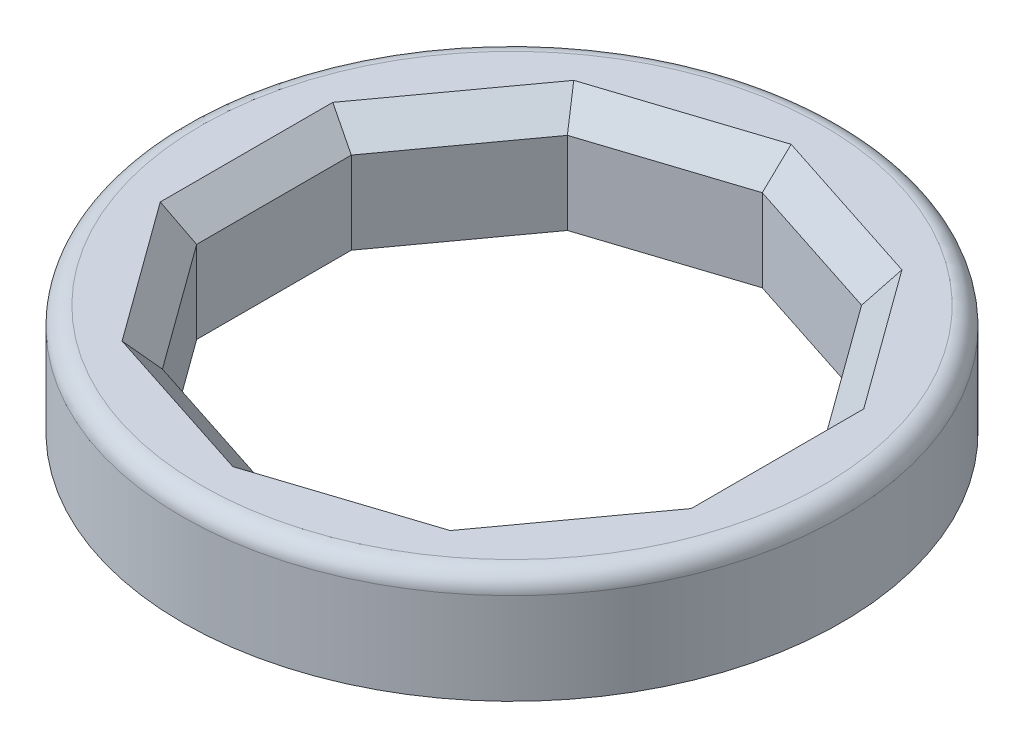
ISO-10303-21;
HEADER;
FILE_DESCRIPTION(('STEP AP214'),'2;1');
FILE_NAME('part.step','',(''),(''),'','','');
FILE_SCHEMA(('AUTOMOTIVE_DESIGN { 1 0 10303 214 1 1 1 1 }'));
ENDSEC;
DATA;
#1=APPLICATION_CONTEXT('core data for automotive mechanical design processes');
#2=APPLICATION_PROTOCOL_DEFINITION('international standard','automotive_design',2000,#1);
#3=PRODUCT_CONTEXT('',#1,'mechanical');
#4=PRODUCT('Part','Part','',(#3));
#5=PRODUCT_RELATED_PRODUCT_CATEGORY('part','',(#4));
#6=PRODUCT_DEFINITION_FORMATION('','',#4);
#7=PRODUCT_DEFINITION_CONTEXT('part definition',#1,'design');
#8=PRODUCT_DEFINITION('design','',#6,#7);
#9=PRODUCT_DEFINITION_SHAPE('','',#8);
#10=(LENGTH_UNIT() NAMED_UNIT(*) SI_UNIT(.MILLI.,.METRE.));
#11=(NAMED_UNIT(*) PLANE_ANGLE_UNIT() SI_UNIT($,.RADIAN.));
#12=(NAMED_UNIT(*) SI_UNIT($,.STERADIAN.) SOLID_ANGLE_UNIT());
#13=UNCERTAINTY_MEASURE_WITH_UNIT(LENGTH_MEASURE(1.E-05),#10,'distance_accuracy_value','');
#14=(GEOMETRIC_REPRESENTATION_CONTEXT(3) GLOBAL_UNCERTAINTY_ASSIGNED_CONTEXT((#13)) GLOBAL_UNIT_ASSIGNED_CONTEXT((#10,
#11,#12)) REPRESENTATION_CONTEXT('',''));
#15=CARTESIAN_POINT('',(0.,0.,0.));
#16=DIRECTION('',(0.,0.,1.));
#17=DIRECTION('',(1.,0.,0.));
#18=AXIS2_PLACEMENT_3D('',#15,#16,#17);
#19=CARTESIAN_POINT('',(0.,12.,0.));
#20=DIRECTION('',(0.,1.,0.));
#21=DIRECTION('',(0.,0.,1.));
#22=AXIS2_PLACEMENT_3D('',#19,#20,#21);
#23=PLANE('',#22);
#24=DIRECTION('',(-0.951056516295154,0.,0.309016994374948));
#25=VECTOR('',#24,1.);
#26=CARTESIAN_POINT('',(8.96149283687351,12.,27.5806389725595));
#27=LINE('',#26,#25);
#28=CARTESIAN_POINT('',(17.922985673747,12.,24.6688734422092));
#29=VERTEX_POINT('',#28);
#30=CARTESIAN_POINT('',(0.,12.,30.4924045029098));
#31=VERTEX_POINT('',#30);
#32=EDGE_CURVE('E282',#29,#31,#27,.T.);
#33=ORIENTED_EDGE('',*,*,#32,.T.);
#34=DIRECTION('',(-0.951056516295154,0.,-0.309016994374947));
#35=VECTOR('',#34,1.);
#36=CARTESIAN_POINT('',(-8.96149283687348,12.,27.5806389725595));
#37=LINE('',#36,#35);
#38=CARTESIAN_POINT('',(-17.922985673747,12.,24.6688734422092));
#39=VERTEX_POINT('',#38);
#40=EDGE_CURVE('E285',#31,#39,#37,.T.);
#41=ORIENTED_EDGE('',*,*,#40,.T.);
#42=DIRECTION('',(-0.587785252292474,0.,-0.809016994374947));
#43=VECTOR('',#42,1.);
#44=CARTESIAN_POINT('',(-23.4614928368735,12.,17.0457723164817));
#45=LINE('',#44,#43);
#46=CARTESIAN_POINT('',(-29.,12.,9.4226711907543));
#47=VERTEX_POINT('',#46);
#48=EDGE_CURVE('E258',#39,#47,#45,.T.);
#49=ORIENTED_EDGE('',*,*,#48,.T.);
#50=DIRECTION('',(0.,0.,-1.));
#51=VECTOR('',#50,1.);
#52=CARTESIAN_POINT('',(-29.,12.,0.));
#53=LINE('',#52,#51);
#54=CARTESIAN_POINT('',(-29.,12.,-9.42267119075427));
#55=VERTEX_POINT('',#54);
#56=EDGE_CURVE('E261',#47,#55,#53,.T.);
#57=ORIENTED_EDGE('',*,*,#56,.T.);
#58=DIRECTION('',(0.587785252292473,0.,-0.809016994374948));
#59=VECTOR('',#58,1.);
#60=CARTESIAN_POINT('',(-23.4614928368735,12.,-17.0457723164817));
#61=LINE('',#60,#59);
#62=CARTESIAN_POINT('',(-17.922985673747,12.,-24.6688734422092));
#63=VERTEX_POINT('',#62);
#64=EDGE_CURVE('E264',#55,#63,#61,.T.);
#65=ORIENTED_EDGE('',*,*,#64,.T.);
#66=DIRECTION('',(0.951056516295154,0.,-0.309016994374948));
#67=VECTOR('',#66,1.);
#68=CARTESIAN_POINT('',(-8.96149283687349,12.,-27.5806389725595));
#69=LINE('',#68,#67);
#70=CARTESIAN_POINT('',(0.,12.,-30.4924045029098));
#71=VERTEX_POINT('',#70);
#72=EDGE_CURVE('E267',#63,#71,#69,.T.);
#73=ORIENTED_EDGE('',*,*,#72,.T.);
#74=DIRECTION('',(0.951056516295154,0.,0.309016994374947));
#75=VECTOR('',#74,1.);
#76=CARTESIAN_POINT('',(8.96149283687348,12.,-27.5806389725595));
#77=LINE('',#76,#75);
#78=CARTESIAN_POINT('',(17.922985673747,12.,-24.6688734422092));
#79=VERTEX_POINT('',#78);
#80=EDGE_CURVE('E270',#71,#79,#77,.T.);
#81=ORIENTED_EDGE('',*,*,#80,.T.);
#82=DIRECTION('',(0.587785252292473,0.,0.809016994374947));
#83=VECTOR('',#82,1.);
#84=CARTESIAN_POINT('',(23.4614928368735,12.,-17.0457723164817));
#85=LINE('',#84,#83);
#86=CARTESIAN_POINT('',(29.,12.,-9.4226711907543));
#87=VERTEX_POINT('',#86);
#88=EDGE_CURVE('E273',#79,#87,#85,.T.);
#89=ORIENTED_EDGE('',*,*,#88,.T.);
#90=DIRECTION('',(0.,0.,1.));
#91=VECTOR('',#90,1.);
#92=CARTESIAN_POINT('',(29.,12.,0.));
#93=LINE('',#92,#91);
#94=CARTESIAN_POINT('',(29.,12.,9.42267119075429));
#95=VERTEX_POINT('',#94);
#96=EDGE_CURVE('E276',#87,#95,#93,.T.);
#97=ORIENTED_EDGE('',*,*,#96,.T.);
#98=DIRECTION('',(-0.587785252292473,0.,0.809016994374948));
#99=VECTOR('',#98,1.);
#100=CARTESIAN_POINT('',(23.4614928368735,12.,17.0457723164817));
#101=LINE('',#100,#99);
#102=EDGE_CURVE('E279',#95,#29,#101,.T.);
#103=ORIENTED_EDGE('',*,*,#102,.T.);
#104=EDGE_LOOP('',(#33,#41,#49,#57,#65,#73,#81,#89,#97,#103));
#105=FACE_BOUND('',#104,.T.);
#106=CARTESIAN_POINT('',(0.,12.,0.));
#107=DIRECTION('',(0.,1.,0.));
#108=DIRECTION('',(0.,0.,1.));
#109=AXIS2_PLACEMENT_3D('',#106,#107,#108);
#110=CIRCLE('',#109,34.);
#111=CARTESIAN_POINT('',(0.,12.,34.));
#112=VERTEX_POINT('',#111);
#113=EDGE_CURVE('E246',#112,#112,#110,.T.);
#114=ORIENTED_EDGE('',*,*,#113,.T.);
#115=EDGE_LOOP('',(#114));
#116=FACE_BOUND('',#115,.T.);
#117=ADVANCED_FACE('F45',(#105,#116),#23,.T.);
#118=CARTESIAN_POINT('',(0.,0.,0.));
#119=DIRECTION('',(0.,1.,0.));
#120=DIRECTION('',(0.,0.,1.));
#121=AXIS2_PLACEMENT_3D('',#118,#119,#120);
#122=PLANE('',#121);
#123=CARTESIAN_POINT('',(0.,0.,0.));
#124=DIRECTION('',(0.,1.,0.));
#125=DIRECTION('',(0.,0.,1.));
#126=AXIS2_PLACEMENT_3D('',#123,#124,#125);
#127=CIRCLE('',#126,36.);
#128=CARTESIAN_POINT('',(0.,0.,36.));
#129=VERTEX_POINT('',#128);
#130=EDGE_CURVE('E167',#129,#129,#127,.T.);
#131=ORIENTED_EDGE('',*,*,#130,.F.);
#132=EDGE_LOOP('',(#131));
#133=FACE_BOUND('',#132,.T.);
#134=DIRECTION('',(-0.587785252292473,0.,-0.809016994374947));
#135=VECTOR('',#134,1.);
#136=CARTESIAN_POINT('',(26.,0.,-8.44791210205557));
#137=LINE('',#136,#135);
#138=CARTESIAN_POINT('',(26.,0.,-8.44791210205557));
#139=VERTEX_POINT('',#138);
#140=CARTESIAN_POINT('',(16.0688837074973,0.,-22.1169210171531));
#141=VERTEX_POINT('',#140);
#142=EDGE_CURVE('E160',#139,#141,#137,.T.);
#143=ORIENTED_EDGE('',*,*,#142,.T.);
#144=DIRECTION('',(-0.951056516295154,0.,-0.309016994374947));
#145=VECTOR('',#144,1.);
#146=CARTESIAN_POINT('',(16.0688837074973,0.,-22.1169210171531));
#147=LINE('',#146,#145);
#148=CARTESIAN_POINT('',(0.,0.,-27.338017830195));
#149=VERTEX_POINT('',#148);
#150=EDGE_CURVE('E171',#141,#149,#147,.T.);
#151=ORIENTED_EDGE('',*,*,#150,.T.);
#152=DIRECTION('',(-0.951056516295153,0.,0.309016994374948));
#153=VECTOR('',#152,1.);
#154=CARTESIAN_POINT('',(0.,0.,-27.338017830195));
#155=LINE('',#154,#153);
#156=CARTESIAN_POINT('',(-16.0688837074973,0.,-22.116921017153));
#157=VERTEX_POINT('',#156);
#158=EDGE_CURVE('E178',#149,#157,#155,.T.);
#159=ORIENTED_EDGE('',*,*,#158,.T.);
#160=DIRECTION('',(-0.587785252292473,0.,0.809016994374948));
#161=VECTOR('',#160,1.);
#162=CARTESIAN_POINT('',(-16.0688837074973,0.,-22.116921017153));
#163=LINE('',#162,#161);
#164=CARTESIAN_POINT('',(-26.,0.,-8.44791210205556));
#165=VERTEX_POINT('',#164);
#166=EDGE_CURVE('E192',#157,#165,#163,.T.);
#167=ORIENTED_EDGE('',*,*,#166,.T.);
#168=DIRECTION('',(0.,0.,1.));
#169=VECTOR('',#168,1.);
#170=CARTESIAN_POINT('',(-26.,0.,-8.44791210205556));
#171=LINE('',#170,#169);
#172=CARTESIAN_POINT('',(-26.,0.,8.44791210205556));
#173=VERTEX_POINT('',#172);
#174=EDGE_CURVE('E196',#165,#173,#171,.T.);
#175=ORIENTED_EDGE('',*,*,#174,.T.);
#176=DIRECTION('',(0.587785252292474,0.,0.809016994374947));
#177=VECTOR('',#176,1.);
#178=CARTESIAN_POINT('',(-26.,0.,8.44791210205556));
#179=LINE('',#178,#177);
#180=CARTESIAN_POINT('',(-16.0688837074973,0.,22.116921017153));
#181=VERTEX_POINT('',#180);
#182=EDGE_CURVE('E200',#173,#181,#179,.T.);
#183=ORIENTED_EDGE('',*,*,#182,.T.);
#184=DIRECTION('',(0.951056516295154,0.,0.309016994374947));
#185=VECTOR('',#184,1.);
#186=CARTESIAN_POINT('',(-16.0688837074973,0.,22.116921017153));
#187=LINE('',#186,#185);
#188=CARTESIAN_POINT('',(0.,0.,27.338017830195));
#189=VERTEX_POINT('',#188);
#190=EDGE_CURVE('E204',#181,#189,#187,.T.);
#191=ORIENTED_EDGE('',*,*,#190,.T.);
#192=DIRECTION('',(0.951056516295153,0.,-0.309016994374948));
#193=VECTOR('',#192,1.);
#194=CARTESIAN_POINT('',(0.,0.,27.338017830195));
#195=LINE('',#194,#193);
#196=CARTESIAN_POINT('',(16.0688837074973,0.,22.116921017153));
#197=VERTEX_POINT('',#196);
#198=EDGE_CURVE('E208',#189,#197,#195,.T.);
#199=ORIENTED_EDGE('',*,*,#198,.T.);
#200=DIRECTION('',(0.587785252292473,0.,-0.809016994374948));
#201=VECTOR('',#200,1.);
#202=CARTESIAN_POINT('',(16.0688837074973,0.,22.116921017153));
#203=LINE('',#202,#201);
#204=CARTESIAN_POINT('',(26.,0.,8.44791210205556));
#205=VERTEX_POINT('',#204);
#206=EDGE_CURVE('E212',#197,#205,#203,.T.);
#207=ORIENTED_EDGE('',*,*,#206,.T.);
#208=DIRECTION('',(0.,0.,-1.));
#209=VECTOR('',#208,1.);
#210=CARTESIAN_POINT('',(26.,0.,8.44791210205556));
#211=LINE('',#210,#209);
#212=EDGE_CURVE('E183',#205,#139,#211,.T.);
#213=ORIENTED_EDGE('',*,*,#212,.T.);
#214=EDGE_LOOP('',(#143,#151,#159,#167,#175,#183,#191,#199,#207,#213));
#215=FACE_BOUND('',#214,.T.);
#216=ADVANCED_FACE('F180',(#133,#215),#122,.F.);
#217=CARTESIAN_POINT('',(0.,12.,0.));
#218=DIRECTION('',(0.,-1.,0.));
#219=DIRECTION('',(0.,0.,-1.));
#220=AXIS2_PLACEMENT_3D('',#217,#218,#219);
#221=CYLINDRICAL_SURFACE('',#220,36.);
#222=CARTESIAN_POINT('',(0.,10.,0.));
#223=DIRECTION('',(0.,1.,0.));
#224=DIRECTION('',(0.,0.,1.));
#225=AXIS2_PLACEMENT_3D('',#222,#223,#224);
#226=CIRCLE('',#225,36.);
#227=CARTESIAN_POINT('',(0.,10.,36.));
#228=VERTEX_POINT('',#227);
#229=EDGE_CURVE('E250',#228,#228,#226,.F.);
#230=ORIENTED_EDGE('',*,*,#229,.T.);
#231=EDGE_LOOP('',(#230));
#232=FACE_BOUND('',#231,.T.);
#233=ORIENTED_EDGE('',*,*,#130,.T.);
#234=EDGE_LOOP('',(#233));
#235=FACE_BOUND('',#234,.T.);
#236=ADVANCED_FACE('F426',(#232,#235),#221,.T.);
#237=CARTESIAN_POINT('',(26.,12.,-8.44791210205557));
#238=DIRECTION('',(-0.809016994374947,0.,0.587785252292473));
#239=DIRECTION('',(0.587785252292473,0.,0.809016994374947));
#240=AXIS2_PLACEMENT_3D('',#237,#238,#239);
#241=PLANE('',#240);
#242=DIRECTION('',(0.,-1.,0.));
#243=VECTOR('',#242,1.);
#244=CARTESIAN_POINT('',(26.,12.,-8.44791210205557));
#245=LINE('',#244,#243);
#246=CARTESIAN_POINT('',(26.,9.,-8.44791210205557));
#247=VERTEX_POINT('',#246);
#248=EDGE_CURVE('E217',#247,#139,#245,.T.);
#249=ORIENTED_EDGE('',*,*,#248,.F.);
#250=DIRECTION('',(-0.587785252292473,0.,-0.809016994374947));
#251=VECTOR('',#250,1.);
#252=CARTESIAN_POINT('',(26.,9.,-8.44791210205557));
#253=LINE('',#252,#251);
#254=CARTESIAN_POINT('',(16.0688837074973,9.,-22.1169210171531));
#255=VERTEX_POINT('',#254);
#256=EDGE_CURVE('E163',#247,#255,#253,.T.);
#257=ORIENTED_EDGE('',*,*,#256,.T.);
#258=DIRECTION('',(0.,-1.,0.));
#259=VECTOR('',#258,1.);
#260=CARTESIAN_POINT('',(16.0688837074973,12.,-22.1169210171531));
#261=LINE('',#260,#259);
#262=EDGE_CURVE('E155',#255,#141,#261,.T.);
#263=ORIENTED_EDGE('',*,*,#262,.T.);
#264=ORIENTED_EDGE('',*,*,#142,.F.);
#265=EDGE_LOOP('',(#249,#257,#263,#264));
#266=FACE_BOUND('',#265,.T.);
#267=ADVANCED_FACE('F158',(#266),#241,.T.);
#268=CARTESIAN_POINT('',(16.0688837074973,12.,-22.1169210171531));
#269=DIRECTION('',(-0.309016994374947,0.,0.951056516295154));
#270=DIRECTION('',(0.951056516295154,0.,0.309016994374947));
#271=AXIS2_PLACEMENT_3D('',#268,#269,#270);
#272=PLANE('',#271);
#273=ORIENTED_EDGE('',*,*,#262,.F.);
#274=DIRECTION('',(-0.951056516295154,0.,-0.309016994374947));
#275=VECTOR('',#274,1.);
#276=CARTESIAN_POINT('',(16.0688837074973,9.,-22.1169210171531));
#277=LINE('',#276,#275);
#278=CARTESIAN_POINT('',(0.,9.,-27.338017830195));
#279=VERTEX_POINT('',#278);
#280=EDGE_CURVE('E300',#255,#279,#277,.T.);
#281=ORIENTED_EDGE('',*,*,#280,.T.);
#282=DIRECTION('',(0.,-1.,0.));
#283=VECTOR('',#282,1.);
#284=CARTESIAN_POINT('',(0.,12.,-27.338017830195));
#285=LINE('',#284,#283);
#286=EDGE_CURVE('E168',#279,#149,#285,.T.);
#287=ORIENTED_EDGE('',*,*,#286,.T.);
#288=ORIENTED_EDGE('',*,*,#150,.F.);
#289=EDGE_LOOP('',(#273,#281,#287,#288));
#290=FACE_BOUND('',#289,.T.);
#291=ADVANCED_FACE('F172',(#290),#272,.T.);
#292=CARTESIAN_POINT('',(0.,12.,-27.338017830195));
#293=DIRECTION('',(0.309016994374948,0.,0.951056516295154));
#294=DIRECTION('',(0.951056516295154,0.,-0.309016994374948));
#295=AXIS2_PLACEMENT_3D('',#292,#293,#294);
#296=PLANE('',#295);
#297=ORIENTED_EDGE('',*,*,#286,.F.);
#298=DIRECTION('',(-0.951056516295154,0.,0.309016994374948));
#299=VECTOR('',#298,1.);
#300=CARTESIAN_POINT('',(0.,9.,-27.338017830195));
#301=LINE('',#300,#299);
#302=CARTESIAN_POINT('',(-16.0688837074973,9.,-22.116921017153));
#303=VERTEX_POINT('',#302);
#304=EDGE_CURVE('E303',#279,#303,#301,.T.);
#305=ORIENTED_EDGE('',*,*,#304,.T.);
#306=DIRECTION('',(0.,-1.,0.));
#307=VECTOR('',#306,1.);
#308=CARTESIAN_POINT('',(-16.0688837074973,12.,-22.116921017153));
#309=LINE('',#308,#307);
#310=EDGE_CURVE('E238',#303,#157,#309,.T.);
#311=ORIENTED_EDGE('',*,*,#310,.T.);
#312=ORIENTED_EDGE('',*,*,#158,.F.);
#313=EDGE_LOOP('',(#297,#305,#311,#312));
#314=FACE_BOUND('',#313,.T.);
#315=ADVANCED_FACE('F351',(#314),#296,.T.);
#316=CARTESIAN_POINT('',(-16.0688837074973,12.,-22.116921017153));
#317=DIRECTION('',(0.809016994374948,0.,0.587785252292473));
#318=DIRECTION('',(0.587785252292473,0.,-0.809016994374948));
#319=AXIS2_PLACEMENT_3D('',#316,#317,#318);
#320=PLANE('',#319);
#321=ORIENTED_EDGE('',*,*,#310,.F.);
#322=DIRECTION('',(-0.587785252292473,0.,0.809016994374948));
#323=VECTOR('',#322,1.);
#324=CARTESIAN_POINT('',(-16.0688837074973,9.,-22.116921017153));
#325=LINE('',#324,#323);
#326=CARTESIAN_POINT('',(-26.,9.,-8.44791210205556));
#327=VERTEX_POINT('',#326);
#328=EDGE_CURVE('E71',#303,#327,#325,.T.);
#329=ORIENTED_EDGE('',*,*,#328,.T.);
#330=DIRECTION('',(0.,-1.,0.));
#331=VECTOR('',#330,1.);
#332=CARTESIAN_POINT('',(-26.,12.,-8.44791210205556));
#333=LINE('',#332,#331);
#334=EDGE_CURVE('E235',#327,#165,#333,.T.);
#335=ORIENTED_EDGE('',*,*,#334,.T.);
#336=ORIENTED_EDGE('',*,*,#166,.F.);
#337=EDGE_LOOP('',(#321,#329,#335,#336));
#338=FACE_BOUND('',#337,.T.);
#339=ADVANCED_FACE('F354',(#338),#320,.T.);
#340=CARTESIAN_POINT('',(-26.,12.,-8.44791210205556));
#341=DIRECTION('',(1.,0.,0.));
#342=DIRECTION('',(0.,0.,-1.));
#343=AXIS2_PLACEMENT_3D('',#340,#341,#342);
#344=PLANE('',#343);
#345=ORIENTED_EDGE('',*,*,#334,.F.);
#346=DIRECTION('',(0.,0.,1.));
#347=VECTOR('',#346,1.);
#348=CARTESIAN_POINT('',(-26.,9.,-8.44791210205556));
#349=LINE('',#348,#347);
#350=CARTESIAN_POINT('',(-26.,9.,8.44791210205556));
#351=VERTEX_POINT('',#350);
#352=EDGE_CURVE('E56',#327,#351,#349,.T.);
#353=ORIENTED_EDGE('',*,*,#352,.T.);
#354=DIRECTION('',(0.,-1.,0.));
#355=VECTOR('',#354,1.);
#356=CARTESIAN_POINT('',(-26.,12.,8.44791210205556));
#357=LINE('',#356,#355);
#358=EDGE_CURVE('E232',#351,#173,#357,.T.);
#359=ORIENTED_EDGE('',*,*,#358,.T.);
#360=ORIENTED_EDGE('',*,*,#174,.F.);
#361=EDGE_LOOP('',(#345,#353,#359,#360));
#362=FACE_BOUND('',#361,.T.);
#363=ADVANCED_FACE('F357',(#362),#344,.T.);
#364=CARTESIAN_POINT('',(-26.,12.,8.44791210205556));
#365=DIRECTION('',(0.809016994374947,0.,-0.587785252292474));
#366=DIRECTION('',(-0.587785252292474,0.,-0.809016994374947));
#367=AXIS2_PLACEMENT_3D('',#364,#365,#366);
#368=PLANE('',#367);
#369=ORIENTED_EDGE('',*,*,#358,.F.);
#370=DIRECTION('',(0.587785252292474,0.,0.809016994374947));
#371=VECTOR('',#370,1.);
#372=CARTESIAN_POINT('',(-26.,9.,8.44791210205556));
#373=LINE('',#372,#371);
#374=CARTESIAN_POINT('',(-16.0688837074973,9.,22.116921017153));
#375=VERTEX_POINT('',#374);
#376=EDGE_CURVE('E11',#351,#375,#373,.T.);
#377=ORIENTED_EDGE('',*,*,#376,.T.);
#378=DIRECTION('',(0.,-1.,0.));
#379=VECTOR('',#378,1.);
#380=CARTESIAN_POINT('',(-16.0688837074973,12.,22.116921017153));
#381=LINE('',#380,#379);
#382=EDGE_CURVE('E229',#375,#181,#381,.T.);
#383=ORIENTED_EDGE('',*,*,#382,.T.);
#384=ORIENTED_EDGE('',*,*,#182,.F.);
#385=EDGE_LOOP('',(#369,#377,#383,#384));
#386=FACE_BOUND('',#385,.T.);
#387=ADVANCED_FACE('F361',(#386),#368,.T.);
#388=CARTESIAN_POINT('',(-16.0688837074973,12.,22.116921017153));
#389=DIRECTION('',(0.309016994374947,0.,-0.951056516295153));
#390=DIRECTION('',(-0.951056516295154,0.,-0.309016994374947));
#391=AXIS2_PLACEMENT_3D('',#388,#389,#390);
#392=PLANE('',#391);
#393=ORIENTED_EDGE('',*,*,#382,.F.);
#394=DIRECTION('',(0.951056516295154,0.,0.309016994374947));
#395=VECTOR('',#394,1.);
#396=CARTESIAN_POINT('',(-16.0688837074973,9.,22.116921017153));
#397=LINE('',#396,#395);
#398=CARTESIAN_POINT('',(0.,9.,27.338017830195));
#399=VERTEX_POINT('',#398);
#400=EDGE_CURVE('E254',#375,#399,#397,.T.);
#401=ORIENTED_EDGE('',*,*,#400,.T.);
#402=DIRECTION('',(0.,-1.,0.));
#403=VECTOR('',#402,1.);
#404=CARTESIAN_POINT('',(0.,12.,27.338017830195));
#405=LINE('',#404,#403);
#406=EDGE_CURVE('E226',#399,#189,#405,.T.);
#407=ORIENTED_EDGE('',*,*,#406,.T.);
#408=ORIENTED_EDGE('',*,*,#190,.F.);
#409=EDGE_LOOP('',(#393,#401,#407,#408));
#410=FACE_BOUND('',#409,.T.);
#411=ADVANCED_FACE('F366',(#410),#392,.T.);
#412=CARTESIAN_POINT('',(0.,12.,27.338017830195));
#413=DIRECTION('',(-0.309016994374948,0.,-0.951056516295153));
#414=DIRECTION('',(-0.951056516295154,0.,0.309016994374948));
#415=AXIS2_PLACEMENT_3D('',#412,#413,#414);
#416=PLANE('',#415);
#417=ORIENTED_EDGE('',*,*,#406,.F.);
#418=DIRECTION('',(0.951056516295154,0.,-0.309016994374948));
#419=VECTOR('',#418,1.);
#420=CARTESIAN_POINT('',(0.,9.,27.338017830195));
#421=LINE('',#420,#419);
#422=CARTESIAN_POINT('',(16.0688837074973,9.,22.116921017153));
#423=VERTEX_POINT('',#422);
#424=EDGE_CURVE('E289',#399,#423,#421,.T.);
#425=ORIENTED_EDGE('',*,*,#424,.T.);
#426=DIRECTION('',(0.,-1.,0.));
#427=VECTOR('',#426,1.);
#428=CARTESIAN_POINT('',(16.0688837074973,12.,22.116921017153));
#429=LINE('',#428,#427);
#430=EDGE_CURVE('E223',#423,#197,#429,.T.);
#431=ORIENTED_EDGE('',*,*,#430,.T.);
#432=ORIENTED_EDGE('',*,*,#198,.F.);
#433=EDGE_LOOP('',(#417,#425,#431,#432));
#434=FACE_BOUND('',#433,.T.);
#435=ADVANCED_FACE('F371',(#434),#416,.T.);
#436=CARTESIAN_POINT('',(16.0688837074973,12.,22.116921017153));
#437=DIRECTION('',(-0.809016994374948,0.,-0.587785252292473));
#438=DIRECTION('',(-0.587785252292473,0.,0.809016994374948));
#439=AXIS2_PLACEMENT_3D('',#436,#437,#438);
#440=PLANE('',#439);
#441=ORIENTED_EDGE('',*,*,#430,.F.);
#442=DIRECTION('',(0.587785252292473,0.,-0.809016994374948));
#443=VECTOR('',#442,1.);
#444=CARTESIAN_POINT('',(16.0688837074973,9.,22.116921017153));
#445=LINE('',#444,#443);
#446=CARTESIAN_POINT('',(26.,9.,8.44791210205556));
#447=VERTEX_POINT('',#446);
#448=EDGE_CURVE('E292',#423,#447,#445,.T.);
#449=ORIENTED_EDGE('',*,*,#448,.T.);
#450=DIRECTION('',(0.,-1.,0.));
#451=VECTOR('',#450,1.);
#452=CARTESIAN_POINT('',(26.,12.,8.44791210205556));
#453=LINE('',#452,#451);
#454=EDGE_CURVE('E220',#447,#205,#453,.T.);
#455=ORIENTED_EDGE('',*,*,#454,.T.);
#456=ORIENTED_EDGE('',*,*,#206,.F.);
#457=EDGE_LOOP('',(#441,#449,#455,#456));
#458=FACE_BOUND('',#457,.T.);
#459=ADVANCED_FACE('F377',(#458),#440,.T.);
#460=CARTESIAN_POINT('',(26.,12.,8.44791210205556));
#461=DIRECTION('',(-1.,0.,0.));
#462=DIRECTION('',(0.,0.,1.));
#463=AXIS2_PLACEMENT_3D('',#460,#461,#462);
#464=PLANE('',#463);
#465=ORIENTED_EDGE('',*,*,#454,.F.);
#466=DIRECTION('',(0.,0.,-1.));
#467=VECTOR('',#466,1.);
#468=CARTESIAN_POINT('',(26.,9.,8.44791210205556));
#469=LINE('',#468,#467);
#470=EDGE_CURVE('E295',#447,#247,#469,.T.);
#471=ORIENTED_EDGE('',*,*,#470,.T.);
#472=ORIENTED_EDGE('',*,*,#248,.T.);
#473=ORIENTED_EDGE('',*,*,#212,.F.);
#474=EDGE_LOOP('',(#465,#471,#472,#473));
#475=FACE_BOUND('',#474,.T.);
#476=ADVANCED_FACE('F381',(#475),#464,.T.);
#477=CARTESIAN_POINT('',(0.,10.,0.));
#478=DIRECTION('',(0.,1.,0.));
#479=DIRECTION('',(0.,0.,1.));
#480=AXIS2_PLACEMENT_3D('',#477,#478,#479);
#481=TOROIDAL_SURFACE('',#480,34.,2.);
#482=ORIENTED_EDGE('',*,*,#229,.F.);
#483=EDGE_LOOP('',(#482));
#484=FACE_BOUND('',#483,.T.);
#485=ORIENTED_EDGE('',*,*,#113,.F.);
#486=EDGE_LOOP('',(#485));
#487=FACE_BOUND('',#486,.T.);
#488=ADVANCED_FACE('F435',(#484,#487),#481,.T.);
#489=CARTESIAN_POINT('',(16.0688837074973,9.,-22.1169210171531));
#490=DIRECTION('',(0.21850801222441,-0.707106781186549,-0.672498511963956));
#491=DIRECTION('',(-0.951056516295154,0.,-0.309016994374947));
#492=AXIS2_PLACEMENT_3D('',#489,#490,#491);
#493=PLANE('',#492);
#494=DIRECTION('',(0.425919209711469,0.68915175777465,-0.586227499828238));
#495=VECTOR('',#494,1.);
#496=CARTESIAN_POINT('',(14.4575053849383,6.39273510536477,-19.8990490269437));
#497=LINE('',#496,#495);
#498=EDGE_CURVE('E188',#79,#255,#497,.F.);
#499=ORIENTED_EDGE('',*,*,#498,.F.);
#500=ORIENTED_EDGE('',*,*,#80,.F.);
#501=DIRECTION('',(0.,0.68915175777465,-0.724617040067448));
#502=VECTOR('',#501,1.);
#503=CARTESIAN_POINT('',(0.,6.39273510536478,-24.5965772849035));
#504=LINE('',#503,#502);
#505=EDGE_CURVE('E50',#279,#71,#504,.T.);
#506=ORIENTED_EDGE('',*,*,#505,.F.);
#507=ORIENTED_EDGE('',*,*,#280,.F.);
#508=EDGE_LOOP('',(#499,#500,#506,#507));
#509=FACE_BOUND('',#508,.T.);
#510=ADVANCED_FACE('F48',(#509),#493,.F.);
#511=CARTESIAN_POINT('',(0.,9.,-27.338017830195));
#512=DIRECTION('',(-0.21850801222441,-0.707106781186549,-0.672498511963956));
#513=DIRECTION('',(-0.951056516295154,0.,0.309016994374948));
#514=AXIS2_PLACEMENT_3D('',#511,#512,#513);
#515=PLANE('',#514);
#516=ORIENTED_EDGE('',*,*,#505,.T.);
#517=ORIENTED_EDGE('',*,*,#72,.F.);
#518=DIRECTION('',(-0.425919209711467,0.689151757774651,-0.586227499828239));
#519=VECTOR('',#518,1.);
#520=CARTESIAN_POINT('',(-14.4575053849383,6.39273510536482,-19.8990490269437));
#521=LINE('',#520,#519);
#522=EDGE_CURVE('E336',#303,#63,#521,.T.);
#523=ORIENTED_EDGE('',*,*,#522,.F.);
#524=ORIENTED_EDGE('',*,*,#304,.F.);
#525=EDGE_LOOP('',(#516,#517,#523,#524));
#526=FACE_BOUND('',#525,.T.);
#527=ADVANCED_FACE('F397',(#526),#515,.F.);
#528=CARTESIAN_POINT('',(26.,9.,-8.44791210205557));
#529=DIRECTION('',(0.572061402817683,-0.707106781186549,-0.415626937777453));
#530=DIRECTION('',(-0.587785252292473,0.,-0.809016994374947));
#531=AXIS2_PLACEMENT_3D('',#528,#529,#530);
#532=PLANE('',#531);
#533=ORIENTED_EDGE('',*,*,#498,.T.);
#534=ORIENTED_EDGE('',*,*,#256,.F.);
#535=DIRECTION('',(0.689151757774653,0.689151757774651,-0.223918979794514));
#536=VECTOR('',#535,1.);
#537=CARTESIAN_POINT('',(23.3927351053648,6.39273510536478,-7.60076038449197));
#538=LINE('',#537,#536);
#539=EDGE_CURVE('E332',#87,#247,#538,.F.);
#540=ORIENTED_EDGE('',*,*,#539,.F.);
#541=ORIENTED_EDGE('',*,*,#88,.F.);
#542=EDGE_LOOP('',(#533,#534,#540,#541));
#543=FACE_BOUND('',#542,.T.);
#544=ADVANCED_FACE('F344',(#543),#532,.F.);
#545=CARTESIAN_POINT('',(-16.0688837074973,9.,-22.116921017153));
#546=DIRECTION('',(-0.572061402817684,-0.707106781186548,-0.415626937777453));
#547=DIRECTION('',(-0.587785252292473,0.,0.809016994374948));
#548=AXIS2_PLACEMENT_3D('',#545,#546,#547);
#549=PLANE('',#548);
#550=ORIENTED_EDGE('',*,*,#522,.T.);
#551=ORIENTED_EDGE('',*,*,#64,.F.);
#552=DIRECTION('',(-0.689151757774653,0.689151757774651,-0.223918979794511));
#553=VECTOR('',#552,1.);
#554=CARTESIAN_POINT('',(-23.3927351053648,6.39273510536476,-7.60076038449197));
#555=LINE('',#554,#553);
#556=EDGE_CURVE('E328',#327,#55,#555,.T.);
#557=ORIENTED_EDGE('',*,*,#556,.F.);
#558=ORIENTED_EDGE('',*,*,#328,.F.);
#559=EDGE_LOOP('',(#550,#551,#557,#558));
#560=FACE_BOUND('',#559,.T.);
#561=ADVANCED_FACE('F399',(#560),#549,.F.);
#562=CARTESIAN_POINT('',(26.,9.,8.44791210205556));
#563=DIRECTION('',(0.707106781186546,-0.707106781186549,0.));
#564=DIRECTION('',(0.,0.,-1.));
#565=AXIS2_PLACEMENT_3D('',#562,#563,#564);
#566=PLANE('',#565);
#567=ORIENTED_EDGE('',*,*,#539,.T.);
#568=ORIENTED_EDGE('',*,*,#470,.F.);
#569=DIRECTION('',(0.689151757774653,0.689151757774651,0.223918979794513));
#570=VECTOR('',#569,1.);
#571=CARTESIAN_POINT('',(23.3927351053648,6.39273510536478,7.60076038449197));
#572=LINE('',#571,#570);
#573=EDGE_CURVE('E324',#95,#447,#572,.F.);
#574=ORIENTED_EDGE('',*,*,#573,.F.);
#575=ORIENTED_EDGE('',*,*,#96,.F.);
#576=EDGE_LOOP('',(#567,#568,#574,#575));
#577=FACE_BOUND('',#576,.T.);
#578=ADVANCED_FACE('F384',(#577),#566,.F.);
#579=CARTESIAN_POINT('',(-26.,9.,-8.44791210205556));
#580=DIRECTION('',(-0.707106781186546,-0.707106781186549,0.));
#581=DIRECTION('',(0.,0.,1.));
#582=AXIS2_PLACEMENT_3D('',#579,#580,#581);
#583=PLANE('',#582);
#584=ORIENTED_EDGE('',*,*,#556,.T.);
#585=ORIENTED_EDGE('',*,*,#56,.F.);
#586=DIRECTION('',(-0.689151757774652,0.68915175777465,0.223918979794516));
#587=VECTOR('',#586,1.);
#588=CARTESIAN_POINT('',(-23.3927351053648,6.39273510536476,7.60076038449195));
#589=LINE('',#588,#587);
#590=EDGE_CURVE('E320',#351,#47,#589,.T.);
#591=ORIENTED_EDGE('',*,*,#590,.F.);
#592=ORIENTED_EDGE('',*,*,#352,.F.);
#593=EDGE_LOOP('',(#584,#585,#591,#592));
#594=FACE_BOUND('',#593,.T.);
#595=ADVANCED_FACE('F402',(#594),#583,.F.);
#596=CARTESIAN_POINT('',(16.0688837074973,9.,22.116921017153));
#597=DIRECTION('',(0.572061402817684,-0.707106781186549,0.415626937777453));
#598=DIRECTION('',(0.587785252292473,0.,-0.809016994374948));
#599=AXIS2_PLACEMENT_3D('',#596,#597,#598);
#600=PLANE('',#599);
#601=ORIENTED_EDGE('',*,*,#573,.T.);
#602=ORIENTED_EDGE('',*,*,#448,.F.);
#603=DIRECTION('',(0.425919209711469,0.68915175777465,0.586227499828239));
#604=VECTOR('',#603,1.);
#605=CARTESIAN_POINT('',(14.4575053849383,6.39273510536481,19.8990490269437));
#606=LINE('',#605,#604);
#607=EDGE_CURVE('E316',#29,#423,#606,.F.);
#608=ORIENTED_EDGE('',*,*,#607,.F.);
#609=ORIENTED_EDGE('',*,*,#102,.F.);
#610=EDGE_LOOP('',(#601,#602,#608,#609));
#611=FACE_BOUND('',#610,.T.);
#612=ADVANCED_FACE('F388',(#611),#600,.F.);
#613=CARTESIAN_POINT('',(-26.,9.,8.44791210205556));
#614=DIRECTION('',(-0.572061402817683,-0.707106781186549,0.415626937777453));
#615=DIRECTION('',(0.587785252292474,0.,0.809016994374947));
#616=AXIS2_PLACEMENT_3D('',#613,#614,#615);
#617=PLANE('',#616);
#618=ORIENTED_EDGE('',*,*,#590,.T.);
#619=ORIENTED_EDGE('',*,*,#48,.F.);
#620=DIRECTION('',(0.42591920971147,-0.68915175777465,-0.586227499828238));
#621=VECTOR('',#620,1.);
#622=CARTESIAN_POINT('',(-16.0688837074973,9.,22.116921017153));
#623=LINE('',#622,#621);
#624=EDGE_CURVE('E313',#375,#39,#623,.F.);
#625=ORIENTED_EDGE('',*,*,#624,.F.);
#626=ORIENTED_EDGE('',*,*,#376,.F.);
#627=EDGE_LOOP('',(#618,#619,#625,#626));
#628=FACE_BOUND('',#627,.T.);
#629=ADVANCED_FACE('F406',(#628),#617,.F.);
#630=CARTESIAN_POINT('',(0.,9.,27.338017830195));
#631=DIRECTION('',(0.218508012224411,-0.707106781186549,0.672498511963956));
#632=DIRECTION('',(0.951056516295154,0.,-0.309016994374948));
#633=AXIS2_PLACEMENT_3D('',#630,#631,#632);
#634=PLANE('',#633);
#635=ORIENTED_EDGE('',*,*,#607,.T.);
#636=ORIENTED_EDGE('',*,*,#424,.F.);
#637=DIRECTION('',(0.,0.68915175777465,0.724617040067448));
#638=VECTOR('',#637,1.);
#639=CARTESIAN_POINT('',(0.,6.39273510536478,24.5965772849034));
#640=LINE('',#639,#638);
#641=EDGE_CURVE('E310',#31,#399,#640,.F.);
#642=ORIENTED_EDGE('',*,*,#641,.F.);
#643=ORIENTED_EDGE('',*,*,#32,.F.);
#644=EDGE_LOOP('',(#635,#636,#642,#643));
#645=FACE_BOUND('',#644,.T.);
#646=ADVANCED_FACE('F411',(#645),#634,.F.);
#647=CARTESIAN_POINT('',(-16.0688837074973,9.,22.116921017153));
#648=DIRECTION('',(-0.21850801222441,-0.707106781186549,0.672498511963956));
#649=DIRECTION('',(0.951056516295154,0.,0.309016994374947));
#650=AXIS2_PLACEMENT_3D('',#647,#648,#649);
#651=PLANE('',#650);
#652=ORIENTED_EDGE('',*,*,#624,.T.);
#653=ORIENTED_EDGE('',*,*,#40,.F.);
#654=ORIENTED_EDGE('',*,*,#641,.T.);
#655=ORIENTED_EDGE('',*,*,#400,.F.);
#656=EDGE_LOOP('',(#652,#653,#654,#655));
#657=FACE_BOUND('',#656,.T.);
#658=ADVANCED_FACE('F408',(#657),#651,.F.);
#659=CLOSED_SHELL('',(#117,#216,#236,#267,#291,#315,#339,#363,#387,#411,#435,#459,#476,#488,
#510,#527,#544,#561,#578,#595,#612,#629,#646,#658));
#660=MANIFOLD_SOLID_BREP('B2',#659);
#661=ADVANCED_BREP_SHAPE_REPRESENTATION('',(#18,#660),#14);
#662=SHAPE_DEFINITION_REPRESENTATION(#9,#661);
ENDSEC;
END-ISO-10303-21;
